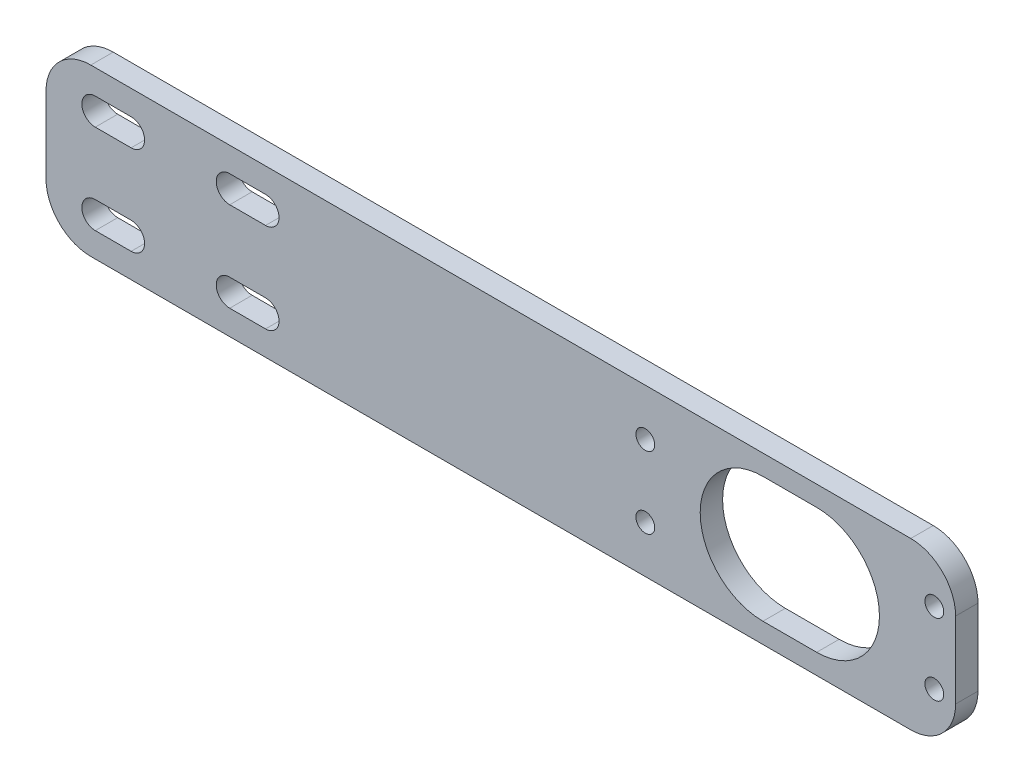
ISO-10303-21;
HEADER;
FILE_DESCRIPTION(('STEP AP214'),'2;1');
FILE_NAME('part.step','',(''),(''),'','','');
FILE_SCHEMA(('AUTOMOTIVE_DESIGN { 1 0 10303 214 1 1 1 1 }'));
ENDSEC;
DATA;
#1=APPLICATION_CONTEXT('core data for automotive mechanical design processes');
#2=APPLICATION_PROTOCOL_DEFINITION('international standard','automotive_design',2000,#1);
#3=PRODUCT_CONTEXT('',#1,'mechanical');
#4=PRODUCT('Part','Part','',(#3));
#5=PRODUCT_RELATED_PRODUCT_CATEGORY('part','',(#4));
#6=PRODUCT_DEFINITION_FORMATION('','',#4);
#7=PRODUCT_DEFINITION_CONTEXT('part definition',#1,'design');
#8=PRODUCT_DEFINITION('design','',#6,#7);
#9=PRODUCT_DEFINITION_SHAPE('','',#8);
#10=(LENGTH_UNIT() NAMED_UNIT(*) SI_UNIT(.MILLI.,.METRE.));
#11=(NAMED_UNIT(*) PLANE_ANGLE_UNIT() SI_UNIT($,.RADIAN.));
#12=(NAMED_UNIT(*) SI_UNIT($,.STERADIAN.) SOLID_ANGLE_UNIT());
#13=UNCERTAINTY_MEASURE_WITH_UNIT(LENGTH_MEASURE(1.E-05),#10,'distance_accuracy_value','');
#14=(GEOMETRIC_REPRESENTATION_CONTEXT(3) GLOBAL_UNCERTAINTY_ASSIGNED_CONTEXT((#13)) GLOBAL_UNIT_ASSIGNED_CONTEXT((#10,
#11,#12)) REPRESENTATION_CONTEXT('',''));
#15=CARTESIAN_POINT('',(0.,0.,0.));
#16=DIRECTION('',(0.,0.,1.));
#17=DIRECTION('',(1.,0.,0.));
#18=AXIS2_PLACEMENT_3D('',#15,#16,#17);
#19=CARTESIAN_POINT('',(0.,0.,-5.));
#20=DIRECTION('',(0.,0.,1.));
#21=DIRECTION('',(1.,0.,0.));
#22=AXIS2_PLACEMENT_3D('',#19,#20,#21);
#23=PLANE('',#22);
#24=CARTESIAN_POINT('',(96.7499999999993,-7.99949999999946,-5.));
#25=DIRECTION('',(0.,0.,-1.));
#26=DIRECTION('',(-1.,0.,0.));
#27=AXIS2_PLACEMENT_3D('',#24,#25,#26);
#28=CIRCLE('',#27,2.09999999999999);
#29=CARTESIAN_POINT('',(94.6499999999994,-7.99949999999946,-5.));
#30=VERTEX_POINT('',#29);
#31=EDGE_CURVE('E468',#30,#30,#28,.T.);
#32=ORIENTED_EDGE('',*,*,#31,.F.);
#33=EDGE_LOOP('',(#32));
#34=FACE_BOUND('',#33,.T.);
#35=CARTESIAN_POINT('',(96.7499999999993,8.00050000000054,-5.));
#36=DIRECTION('',(0.,0.,-1.));
#37=DIRECTION('',(-1.,0.,0.));
#38=AXIS2_PLACEMENT_3D('',#35,#36,#37);
#39=CIRCLE('',#38,2.09999999999999);
#40=CARTESIAN_POINT('',(94.6499999999993,8.00050000000054,-5.));
#41=VERTEX_POINT('',#40);
#42=EDGE_CURVE('E459',#41,#41,#39,.T.);
#43=ORIENTED_EDGE('',*,*,#42,.F.);
#44=EDGE_LOOP('',(#43));
#45=FACE_BOUND('',#44,.T.);
#46=CARTESIAN_POINT('',(32.2499999999993,8.00050000000031,-5.));
#47=DIRECTION('',(0.,0.,-1.));
#48=DIRECTION('',(-1.,0.,0.));
#49=AXIS2_PLACEMENT_3D('',#46,#47,#48);
#50=CIRCLE('',#49,2.1);
#51=CARTESIAN_POINT('',(30.1499999999993,8.00050000000031,-5.));
#52=VERTEX_POINT('',#51);
#53=EDGE_CURVE('E456',#52,#52,#50,.T.);
#54=ORIENTED_EDGE('',*,*,#53,.F.);
#55=EDGE_LOOP('',(#54));
#56=FACE_BOUND('',#55,.T.);
#57=DIRECTION('',(-1.,0.,0.));
#58=VECTOR('',#57,1.);
#59=CARTESIAN_POINT('',(-82.5,-13.,-5.));
#60=LINE('',#59,#58);
#61=CARTESIAN_POINT('',(-82.5,-13.,-5.));
#62=VERTEX_POINT('',#61);
#63=CARTESIAN_POINT('',(-90.5,-13.,-5.));
#64=VERTEX_POINT('',#63);
#65=EDGE_CURVE('E317',#62,#64,#60,.T.);
#66=ORIENTED_EDGE('',*,*,#65,.F.);
#67=CARTESIAN_POINT('',(-82.5,-10.,-5.));
#68=DIRECTION('',(0.,0.,-1.));
#69=DIRECTION('',(-1.,0.,0.));
#70=AXIS2_PLACEMENT_3D('',#67,#68,#69);
#71=CIRCLE('',#70,3.);
#72=CARTESIAN_POINT('',(-82.5,-7.,-5.));
#73=VERTEX_POINT('',#72);
#74=EDGE_CURVE('E55',#73,#62,#71,.T.);
#75=ORIENTED_EDGE('',*,*,#74,.F.);
#76=DIRECTION('',(1.,0.,0.));
#77=VECTOR('',#76,1.);
#78=CARTESIAN_POINT('',(-82.5,-7.,-5.));
#79=LINE('',#78,#77);
#80=CARTESIAN_POINT('',(-90.5,-7.,-5.));
#81=VERTEX_POINT('',#80);
#82=EDGE_CURVE('E306',#81,#73,#79,.T.);
#83=ORIENTED_EDGE('',*,*,#82,.F.);
#84=CARTESIAN_POINT('',(-90.5,-10.,-5.));
#85=DIRECTION('',(0.,0.,-1.));
#86=DIRECTION('',(-1.,0.,0.));
#87=AXIS2_PLACEMENT_3D('',#84,#85,#86);
#88=CIRCLE('',#87,3.);
#89=EDGE_CURVE('E321',#64,#81,#88,.T.);
#90=ORIENTED_EDGE('',*,*,#89,.F.);
#91=EDGE_LOOP('',(#66,#75,#83,#90));
#92=FACE_BOUND('',#91,.T.);
#93=DIRECTION('',(-1.,0.,0.));
#94=VECTOR('',#93,1.);
#95=CARTESIAN_POINT('',(-82.5,7.,-5.));
#96=LINE('',#95,#94);
#97=CARTESIAN_POINT('',(-82.5,7.,-5.));
#98=VERTEX_POINT('',#97);
#99=CARTESIAN_POINT('',(-90.5,7.,-5.));
#100=VERTEX_POINT('',#99);
#101=EDGE_CURVE('E287',#98,#100,#96,.T.);
#102=ORIENTED_EDGE('',*,*,#101,.F.);
#103=CARTESIAN_POINT('',(-82.5,10.,-5.));
#104=DIRECTION('',(0.,0.,-1.));
#105=DIRECTION('',(-1.,0.,0.));
#106=AXIS2_PLACEMENT_3D('',#103,#104,#105);
#107=CIRCLE('',#106,3.);
#108=CARTESIAN_POINT('',(-82.5,13.,-5.));
#109=VERTEX_POINT('',#108);
#110=EDGE_CURVE('E63',#109,#98,#107,.T.);
#111=ORIENTED_EDGE('',*,*,#110,.F.);
#112=DIRECTION('',(1.,0.,0.));
#113=VECTOR('',#112,1.);
#114=CARTESIAN_POINT('',(-82.5,13.,-5.));
#115=LINE('',#114,#113);
#116=CARTESIAN_POINT('',(-90.5,13.,-5.));
#117=VERTEX_POINT('',#116);
#118=EDGE_CURVE('E276',#117,#109,#115,.T.);
#119=ORIENTED_EDGE('',*,*,#118,.F.);
#120=CARTESIAN_POINT('',(-90.5,10.,-5.));
#121=DIRECTION('',(0.,0.,-1.));
#122=DIRECTION('',(-1.,0.,0.));
#123=AXIS2_PLACEMENT_3D('',#120,#121,#122);
#124=CIRCLE('',#123,3.);
#125=EDGE_CURVE('E291',#100,#117,#124,.T.);
#126=ORIENTED_EDGE('',*,*,#125,.F.);
#127=EDGE_LOOP('',(#102,#111,#119,#126));
#128=FACE_BOUND('',#127,.T.);
#129=DIRECTION('',(1.,0.,0.));
#130=VECTOR('',#129,1.);
#131=CARTESIAN_POINT('',(-60.5,13.,-5.));
#132=LINE('',#131,#130);
#133=CARTESIAN_POINT('',(-60.5,13.,-5.));
#134=VERTEX_POINT('',#133);
#135=CARTESIAN_POINT('',(-52.5,13.,-5.));
#136=VERTEX_POINT('',#135);
#137=EDGE_CURVE('E261',#134,#136,#132,.T.);
#138=ORIENTED_EDGE('',*,*,#137,.F.);
#139=CARTESIAN_POINT('',(-60.5,10.,-5.));
#140=DIRECTION('',(0.,0.,-1.));
#141=DIRECTION('',(-1.,0.,0.));
#142=AXIS2_PLACEMENT_3D('',#139,#140,#141);
#143=CIRCLE('',#142,3.);
#144=CARTESIAN_POINT('',(-60.5,7.,-5.));
#145=VERTEX_POINT('',#144);
#146=EDGE_CURVE('E231',#145,#134,#143,.T.);
#147=ORIENTED_EDGE('',*,*,#146,.F.);
#148=DIRECTION('',(-1.,0.,0.));
#149=VECTOR('',#148,1.);
#150=CARTESIAN_POINT('',(-60.5,7.,-5.));
#151=LINE('',#150,#149);
#152=CARTESIAN_POINT('',(-52.5,7.,-5.));
#153=VERTEX_POINT('',#152);
#154=EDGE_CURVE('E249',#153,#145,#151,.T.);
#155=ORIENTED_EDGE('',*,*,#154,.F.);
#156=CARTESIAN_POINT('',(-52.5,10.,-5.));
#157=DIRECTION('',(0.,0.,-1.));
#158=DIRECTION('',(-1.,0.,0.));
#159=AXIS2_PLACEMENT_3D('',#156,#157,#158);
#160=CIRCLE('',#159,3.);
#161=EDGE_CURVE('E252',#136,#153,#160,.T.);
#162=ORIENTED_EDGE('',*,*,#161,.F.);
#163=EDGE_LOOP('',(#138,#147,#155,#162));
#164=FACE_BOUND('',#163,.T.);
#165=DIRECTION('',(1.,0.,0.));
#166=VECTOR('',#165,1.);
#167=CARTESIAN_POINT('',(-60.5,-7.,-5.));
#168=LINE('',#167,#166);
#169=CARTESIAN_POINT('',(-60.5,-7.,-5.));
#170=VERTEX_POINT('',#169);
#171=CARTESIAN_POINT('',(-52.5,-7.,-5.));
#172=VERTEX_POINT('',#171);
#173=EDGE_CURVE('E347',#170,#172,#168,.T.);
#174=ORIENTED_EDGE('',*,*,#173,.F.);
#175=CARTESIAN_POINT('',(-60.5,-10.,-5.));
#176=DIRECTION('',(0.,0.,-1.));
#177=DIRECTION('',(-1.,0.,0.));
#178=AXIS2_PLACEMENT_3D('',#175,#176,#177);
#179=CIRCLE('',#178,3.);
#180=CARTESIAN_POINT('',(-60.5,-13.,-5.));
#181=VERTEX_POINT('',#180);
#182=EDGE_CURVE('E268',#181,#170,#179,.T.);
#183=ORIENTED_EDGE('',*,*,#182,.F.);
#184=DIRECTION('',(-1.,0.,0.));
#185=VECTOR('',#184,1.);
#186=CARTESIAN_POINT('',(-60.5,-13.,-5.));
#187=LINE('',#186,#185);
#188=CARTESIAN_POINT('',(-52.5,-13.,-5.));
#189=VERTEX_POINT('',#188);
#190=EDGE_CURVE('E336',#189,#181,#187,.T.);
#191=ORIENTED_EDGE('',*,*,#190,.F.);
#192=CARTESIAN_POINT('',(-52.5,-10.,-5.));
#193=DIRECTION('',(0.,0.,-1.));
#194=DIRECTION('',(-1.,0.,0.));
#195=AXIS2_PLACEMENT_3D('',#192,#193,#194);
#196=CIRCLE('',#195,3.);
#197=EDGE_CURVE('E350',#172,#189,#196,.T.);
#198=ORIENTED_EDGE('',*,*,#197,.F.);
#199=EDGE_LOOP('',(#174,#183,#191,#198));
#200=FACE_BOUND('',#199,.T.);
#201=DIRECTION('',(1.,0.,0.));
#202=VECTOR('',#201,1.);
#203=CARTESIAN_POINT('',(58.4999999999993,14.,-5.));
#204=LINE('',#203,#202);
#205=CARTESIAN_POINT('',(58.4999999999993,14.,-5.));
#206=VERTEX_POINT('',#205);
#207=CARTESIAN_POINT('',(70.4999999999993,14.,-5.));
#208=VERTEX_POINT('',#207);
#209=EDGE_CURVE('E379',#206,#208,#204,.T.);
#210=ORIENTED_EDGE('',*,*,#209,.F.);
#211=CARTESIAN_POINT('',(58.4999999999992,0.,-5.));
#212=DIRECTION('',(0.,0.,-1.));
#213=DIRECTION('',(-1.,0.,0.));
#214=AXIS2_PLACEMENT_3D('',#211,#212,#213);
#215=CIRCLE('',#214,14.);
#216=CARTESIAN_POINT('',(58.4999999999992,-14.,-5.));
#217=VERTEX_POINT('',#216);
#218=EDGE_CURVE('E357',#217,#206,#215,.T.);
#219=ORIENTED_EDGE('',*,*,#218,.F.);
#220=DIRECTION('',(-1.,0.,0.));
#221=VECTOR('',#220,1.);
#222=CARTESIAN_POINT('',(58.4999999999992,-14.,-5.));
#223=LINE('',#222,#221);
#224=CARTESIAN_POINT('',(70.4999999999993,-14.,-5.));
#225=VERTEX_POINT('',#224);
#226=EDGE_CURVE('E368',#225,#217,#223,.T.);
#227=ORIENTED_EDGE('',*,*,#226,.F.);
#228=CARTESIAN_POINT('',(70.4999999999993,0.,-5.));
#229=DIRECTION('',(0.,0.,-1.));
#230=DIRECTION('',(-1.,0.,0.));
#231=AXIS2_PLACEMENT_3D('',#228,#229,#230);
#232=CIRCLE('',#231,14.);
#233=EDGE_CURVE('E382',#208,#225,#232,.T.);
#234=ORIENTED_EDGE('',*,*,#233,.F.);
#235=EDGE_LOOP('',(#210,#219,#227,#234));
#236=FACE_BOUND('',#235,.T.);
#237=DIRECTION('',(1.,0.,0.));
#238=VECTOR('',#237,1.);
#239=CARTESIAN_POINT('',(-101.5,-18.5,-5.));
#240=LINE('',#239,#238);
#241=CARTESIAN_POINT('',(-91.5,-18.5,-5.));
#242=VERTEX_POINT('',#241);
#243=CARTESIAN_POINT('',(91.5,-18.5,-5.));
#244=VERTEX_POINT('',#243);
#245=EDGE_CURVE('E406',#242,#244,#240,.T.);
#246=ORIENTED_EDGE('',*,*,#245,.F.);
#247=CARTESIAN_POINT('',(-91.5,-8.5,-5.));
#248=DIRECTION('',(0.,0.,1.));
#249=DIRECTION('',(1.,0.,0.));
#250=AXIS2_PLACEMENT_3D('',#247,#248,#249);
#251=CIRCLE('',#250,10.);
#252=CARTESIAN_POINT('',(-101.5,-8.5,-5.));
#253=VERTEX_POINT('',#252);
#254=EDGE_CURVE('E443',#242,#253,#251,.F.);
#255=ORIENTED_EDGE('',*,*,#254,.T.);
#256=DIRECTION('',(0.,-1.,0.));
#257=VECTOR('',#256,1.);
#258=CARTESIAN_POINT('',(-101.5,18.5,-5.));
#259=LINE('',#258,#257);
#260=CARTESIAN_POINT('',(-101.5,8.49999999999999,-5.));
#261=VERTEX_POINT('',#260);
#262=EDGE_CURVE('E403',#261,#253,#259,.T.);
#263=ORIENTED_EDGE('',*,*,#262,.F.);
#264=CARTESIAN_POINT('',(-91.5,8.49999999999999,-5.));
#265=DIRECTION('',(0.,0.,1.));
#266=DIRECTION('',(1.,0.,0.));
#267=AXIS2_PLACEMENT_3D('',#264,#265,#266);
#268=CIRCLE('',#267,10.);
#269=CARTESIAN_POINT('',(-91.5,18.5,-5.));
#270=VERTEX_POINT('',#269);
#271=EDGE_CURVE('E441',#261,#270,#268,.F.);
#272=ORIENTED_EDGE('',*,*,#271,.T.);
#273=DIRECTION('',(-1.,0.,0.));
#274=VECTOR('',#273,1.);
#275=CARTESIAN_POINT('',(-101.5,18.5,-5.));
#276=LINE('',#275,#274);
#277=CARTESIAN_POINT('',(91.5,18.5,-5.));
#278=VERTEX_POINT('',#277);
#279=EDGE_CURVE('E399',#278,#270,#276,.T.);
#280=ORIENTED_EDGE('',*,*,#279,.F.);
#281=CARTESIAN_POINT('',(91.5,8.49999999999999,-5.));
#282=DIRECTION('',(0.,0.,1.));
#283=DIRECTION('',(1.,0.,0.));
#284=AXIS2_PLACEMENT_3D('',#281,#282,#283);
#285=CIRCLE('',#284,10.);
#286=CARTESIAN_POINT('',(101.5,8.49999999999999,-5.));
#287=VERTEX_POINT('',#286);
#288=EDGE_CURVE('E437',#278,#287,#285,.F.);
#289=ORIENTED_EDGE('',*,*,#288,.T.);
#290=DIRECTION('',(0.,1.,0.));
#291=VECTOR('',#290,1.);
#292=CARTESIAN_POINT('',(101.5,18.5,-5.));
#293=LINE('',#292,#291);
#294=CARTESIAN_POINT('',(101.5,-8.5,-5.));
#295=VERTEX_POINT('',#294);
#296=EDGE_CURVE('E396',#295,#287,#293,.T.);
#297=ORIENTED_EDGE('',*,*,#296,.F.);
#298=CARTESIAN_POINT('',(91.5,-8.5,-5.));
#299=DIRECTION('',(0.,0.,1.));
#300=DIRECTION('',(1.,0.,0.));
#301=AXIS2_PLACEMENT_3D('',#298,#299,#300);
#302=CIRCLE('',#301,10.);
#303=EDGE_CURVE('E439',#295,#244,#302,.F.);
#304=ORIENTED_EDGE('',*,*,#303,.T.);
#305=EDGE_LOOP('',(#246,#255,#263,#272,#280,#289,#297,#304));
#306=FACE_BOUND('',#305,.T.);
#307=CARTESIAN_POINT('',(32.2499999999993,-7.99949999999969,-5.));
#308=DIRECTION('',(0.,0.,-1.));
#309=DIRECTION('',(-1.,0.,0.));
#310=AXIS2_PLACEMENT_3D('',#307,#308,#309);
#311=CIRCLE('',#310,2.1);
#312=CARTESIAN_POINT('',(30.1499999999993,-7.99949999999969,-5.));
#313=VERTEX_POINT('',#312);
#314=EDGE_CURVE('E255',#313,#313,#311,.T.);
#315=ORIENTED_EDGE('',*,*,#314,.F.);
#316=EDGE_LOOP('',(#315));
#317=FACE_BOUND('',#316,.T.);
#318=ADVANCED_FACE('F38',(#34,#45,#56,#92,#128,#164,#200,#236,#306,#317),#23,.F.);
#319=CARTESIAN_POINT('',(101.5,18.5,-5.));
#320=DIRECTION('',(1.,0.,0.));
#321=DIRECTION('',(0.,0.,-1.));
#322=AXIS2_PLACEMENT_3D('',#319,#320,#321);
#323=PLANE('',#322);
#324=DIRECTION('',(0.,1.,0.));
#325=VECTOR('',#324,1.);
#326=CARTESIAN_POINT('',(101.5,18.5,0.));
#327=LINE('',#326,#325);
#328=CARTESIAN_POINT('',(101.5,-8.5,0.));
#329=VERTEX_POINT('',#328);
#330=CARTESIAN_POINT('',(101.5,8.49999999999999,0.));
#331=VERTEX_POINT('',#330);
#332=EDGE_CURVE('E389',#329,#331,#327,.T.);
#333=ORIENTED_EDGE('',*,*,#332,.F.);
#334=DIRECTION('',(0.,0.,1.));
#335=VECTOR('',#334,1.);
#336=CARTESIAN_POINT('',(101.5,-8.5,-5.));
#337=LINE('',#336,#335);
#338=EDGE_CURVE('E11',#329,#295,#337,.F.);
#339=ORIENTED_EDGE('',*,*,#338,.T.);
#340=ORIENTED_EDGE('',*,*,#296,.T.);
#341=DIRECTION('',(0.,0.,1.));
#342=VECTOR('',#341,1.);
#343=CARTESIAN_POINT('',(101.5,8.49999999999999,-5.));
#344=LINE('',#343,#342);
#345=EDGE_CURVE('E47',#287,#331,#344,.T.);
#346=ORIENTED_EDGE('',*,*,#345,.T.);
#347=EDGE_LOOP('',(#333,#339,#340,#346));
#348=FACE_BOUND('',#347,.T.);
#349=ADVANCED_FACE('F477',(#348),#323,.T.);
#350=CARTESIAN_POINT('',(-101.5,-18.5,-5.));
#351=DIRECTION('',(0.,-1.,0.));
#352=DIRECTION('',(0.,0.,-1.));
#353=AXIS2_PLACEMENT_3D('',#350,#351,#352);
#354=PLANE('',#353);
#355=DIRECTION('',(1.,0.,0.));
#356=VECTOR('',#355,1.);
#357=CARTESIAN_POINT('',(-101.5,-18.5,0.));
#358=LINE('',#357,#356);
#359=CARTESIAN_POINT('',(-91.5,-18.5,0.));
#360=VERTEX_POINT('',#359);
#361=CARTESIAN_POINT('',(91.5,-18.5,0.));
#362=VERTEX_POINT('',#361);
#363=EDGE_CURVE('E400',#360,#362,#358,.T.);
#364=ORIENTED_EDGE('',*,*,#363,.F.);
#365=DIRECTION('',(0.,0.,1.));
#366=VECTOR('',#365,1.);
#367=CARTESIAN_POINT('',(-91.5,-18.5,-5.));
#368=LINE('',#367,#366);
#369=EDGE_CURVE('E435',#360,#242,#368,.F.);
#370=ORIENTED_EDGE('',*,*,#369,.T.);
#371=ORIENTED_EDGE('',*,*,#245,.T.);
#372=DIRECTION('',(0.,0.,1.));
#373=VECTOR('',#372,1.);
#374=CARTESIAN_POINT('',(91.5,-18.5,-5.));
#375=LINE('',#374,#373);
#376=EDGE_CURVE('E432',#244,#362,#375,.T.);
#377=ORIENTED_EDGE('',*,*,#376,.T.);
#378=EDGE_LOOP('',(#364,#370,#371,#377));
#379=FACE_BOUND('',#378,.T.);
#380=ADVANCED_FACE('F597',(#379),#354,.T.);
#381=CARTESIAN_POINT('',(-101.5,18.5,-5.));
#382=DIRECTION('',(-1.,0.,0.));
#383=DIRECTION('',(0.,0.,1.));
#384=AXIS2_PLACEMENT_3D('',#381,#382,#383);
#385=PLANE('',#384);
#386=ORIENTED_EDGE('',*,*,#262,.T.);
#387=DIRECTION('',(0.,0.,1.));
#388=VECTOR('',#387,1.);
#389=CARTESIAN_POINT('',(-101.5,-8.5,-5.));
#390=LINE('',#389,#388);
#391=CARTESIAN_POINT('',(-101.5,-8.5,0.));
#392=VERTEX_POINT('',#391);
#393=EDGE_CURVE('E421',#253,#392,#390,.T.);
#394=ORIENTED_EDGE('',*,*,#393,.T.);
#395=DIRECTION('',(0.,-1.,0.));
#396=VECTOR('',#395,1.);
#397=CARTESIAN_POINT('',(-101.5,18.5,0.));
#398=LINE('',#397,#396);
#399=CARTESIAN_POINT('',(-101.5,8.49999999999999,0.));
#400=VERTEX_POINT('',#399);
#401=EDGE_CURVE('E415',#400,#392,#398,.T.);
#402=ORIENTED_EDGE('',*,*,#401,.F.);
#403=DIRECTION('',(0.,0.,1.));
#404=VECTOR('',#403,1.);
#405=CARTESIAN_POINT('',(-101.5,8.49999999999999,-5.));
#406=LINE('',#405,#404);
#407=EDGE_CURVE('E409',#400,#261,#406,.F.);
#408=ORIENTED_EDGE('',*,*,#407,.T.);
#409=EDGE_LOOP('',(#386,#394,#402,#408));
#410=FACE_BOUND('',#409,.T.);
#411=ADVANCED_FACE('F600',(#410),#385,.T.);
#412=CARTESIAN_POINT('',(-101.5,18.5,-5.));
#413=DIRECTION('',(0.,1.,0.));
#414=DIRECTION('',(0.,0.,1.));
#415=AXIS2_PLACEMENT_3D('',#412,#413,#414);
#416=PLANE('',#415);
#417=ORIENTED_EDGE('',*,*,#279,.T.);
#418=DIRECTION('',(0.,0.,1.));
#419=VECTOR('',#418,1.);
#420=CARTESIAN_POINT('',(-91.5,18.5,-5.));
#421=LINE('',#420,#419);
#422=CARTESIAN_POINT('',(-91.5,18.5,0.));
#423=VERTEX_POINT('',#422);
#424=EDGE_CURVE('E447',#270,#423,#421,.T.);
#425=ORIENTED_EDGE('',*,*,#424,.T.);
#426=DIRECTION('',(-1.,0.,0.));
#427=VECTOR('',#426,1.);
#428=CARTESIAN_POINT('',(-101.5,18.5,0.));
#429=LINE('',#428,#427);
#430=CARTESIAN_POINT('',(91.5,18.5,0.));
#431=VERTEX_POINT('',#430);
#432=EDGE_CURVE('E412',#431,#423,#429,.T.);
#433=ORIENTED_EDGE('',*,*,#432,.F.);
#434=DIRECTION('',(0.,0.,1.));
#435=VECTOR('',#434,1.);
#436=CARTESIAN_POINT('',(91.5,18.5,-5.));
#437=LINE('',#436,#435);
#438=EDGE_CURVE('E445',#431,#278,#437,.F.);
#439=ORIENTED_EDGE('',*,*,#438,.T.);
#440=EDGE_LOOP('',(#417,#425,#433,#439));
#441=FACE_BOUND('',#440,.T.);
#442=ADVANCED_FACE('F595',(#441),#416,.T.);
#443=CARTESIAN_POINT('',(0.,0.,0.));
#444=DIRECTION('',(0.,0.,1.));
#445=DIRECTION('',(1.,0.,0.));
#446=AXIS2_PLACEMENT_3D('',#443,#444,#445);
#447=PLANE('',#446);
#448=CARTESIAN_POINT('',(96.7499999999993,-7.99949999999946,0.));
#449=DIRECTION('',(0.,0.,1.));
#450=DIRECTION('',(1.,0.,0.));
#451=AXIS2_PLACEMENT_3D('',#448,#449,#450);
#452=CIRCLE('',#451,2.09999999999999);
#453=CARTESIAN_POINT('',(98.8499999999993,-7.99949999999946,0.));
#454=VERTEX_POINT('',#453);
#455=EDGE_CURVE('E42',#454,#454,#452,.T.);
#456=ORIENTED_EDGE('',*,*,#455,.F.);
#457=EDGE_LOOP('',(#456));
#458=FACE_BOUND('',#457,.T.);
#459=CARTESIAN_POINT('',(96.7499999999993,8.00050000000054,0.));
#460=DIRECTION('',(0.,0.,1.));
#461=DIRECTION('',(1.,0.,0.));
#462=AXIS2_PLACEMENT_3D('',#459,#460,#461);
#463=CIRCLE('',#462,2.09999999999999);
#464=CARTESIAN_POINT('',(98.8499999999993,8.00050000000054,0.));
#465=VERTEX_POINT('',#464);
#466=EDGE_CURVE('E457',#465,#465,#463,.T.);
#467=ORIENTED_EDGE('',*,*,#466,.F.);
#468=EDGE_LOOP('',(#467));
#469=FACE_BOUND('',#468,.T.);
#470=CARTESIAN_POINT('',(32.2499999999993,8.00050000000031,0.));
#471=DIRECTION('',(0.,0.,1.));
#472=DIRECTION('',(1.,0.,0.));
#473=AXIS2_PLACEMENT_3D('',#470,#471,#472);
#474=CIRCLE('',#473,2.1);
#475=CARTESIAN_POINT('',(34.3499999999993,8.00050000000031,0.));
#476=VERTEX_POINT('',#475);
#477=EDGE_CURVE('E454',#476,#476,#474,.T.);
#478=ORIENTED_EDGE('',*,*,#477,.F.);
#479=EDGE_LOOP('',(#478));
#480=FACE_BOUND('',#479,.T.);
#481=CARTESIAN_POINT('',(32.2499999999993,-7.99949999999969,0.));
#482=DIRECTION('',(0.,0.,1.));
#483=DIRECTION('',(1.,0.,0.));
#484=AXIS2_PLACEMENT_3D('',#481,#482,#483);
#485=CIRCLE('',#484,2.1);
#486=CARTESIAN_POINT('',(34.3499999999993,-7.99949999999969,0.));
#487=VERTEX_POINT('',#486);
#488=EDGE_CURVE('E318',#487,#487,#485,.T.);
#489=ORIENTED_EDGE('',*,*,#488,.F.);
#490=EDGE_LOOP('',(#489));
#491=FACE_BOUND('',#490,.T.);
#492=CARTESIAN_POINT('',(-82.5,-10.,0.));
#493=DIRECTION('',(0.,0.,-1.));
#494=DIRECTION('',(-1.,0.,0.));
#495=AXIS2_PLACEMENT_3D('',#492,#493,#494);
#496=CIRCLE('',#495,3.);
#497=CARTESIAN_POINT('',(-82.5,-7.,0.));
#498=VERTEX_POINT('',#497);
#499=CARTESIAN_POINT('',(-82.5,-13.,0.));
#500=VERTEX_POINT('',#499);
#501=EDGE_CURVE('E302',#498,#500,#496,.T.);
#502=ORIENTED_EDGE('',*,*,#501,.T.);
#503=DIRECTION('',(-1.,0.,0.));
#504=VECTOR('',#503,1.);
#505=CARTESIAN_POINT('',(-82.5,-13.,0.));
#506=LINE('',#505,#504);
#507=CARTESIAN_POINT('',(-90.5,-13.,0.));
#508=VERTEX_POINT('',#507);
#509=EDGE_CURVE('E305',#500,#508,#506,.T.);
#510=ORIENTED_EDGE('',*,*,#509,.T.);
#511=CARTESIAN_POINT('',(-90.5,-10.,0.));
#512=DIRECTION('',(0.,0.,-1.));
#513=DIRECTION('',(-1.,0.,0.));
#514=AXIS2_PLACEMENT_3D('',#511,#512,#513);
#515=CIRCLE('',#514,3.);
#516=CARTESIAN_POINT('',(-90.5,-7.,0.));
#517=VERTEX_POINT('',#516);
#518=EDGE_CURVE('E309',#508,#517,#515,.T.);
#519=ORIENTED_EDGE('',*,*,#518,.T.);
#520=DIRECTION('',(1.,0.,0.));
#521=VECTOR('',#520,1.);
#522=CARTESIAN_POINT('',(-82.5,-7.,0.));
#523=LINE('',#522,#521);
#524=EDGE_CURVE('E312',#517,#498,#523,.T.);
#525=ORIENTED_EDGE('',*,*,#524,.T.);
#526=EDGE_LOOP('',(#502,#510,#519,#525));
#527=FACE_BOUND('',#526,.T.);
#528=CARTESIAN_POINT('',(-82.5,10.,0.));
#529=DIRECTION('',(0.,0.,-1.));
#530=DIRECTION('',(-1.,0.,0.));
#531=AXIS2_PLACEMENT_3D('',#528,#529,#530);
#532=CIRCLE('',#531,3.);
#533=CARTESIAN_POINT('',(-82.5,13.,0.));
#534=VERTEX_POINT('',#533);
#535=CARTESIAN_POINT('',(-82.5,7.,0.));
#536=VERTEX_POINT('',#535);
#537=EDGE_CURVE('E272',#534,#536,#532,.T.);
#538=ORIENTED_EDGE('',*,*,#537,.T.);
#539=DIRECTION('',(-1.,0.,0.));
#540=VECTOR('',#539,1.);
#541=CARTESIAN_POINT('',(-82.5,7.,0.));
#542=LINE('',#541,#540);
#543=CARTESIAN_POINT('',(-90.5,7.,0.));
#544=VERTEX_POINT('',#543);
#545=EDGE_CURVE('E275',#536,#544,#542,.T.);
#546=ORIENTED_EDGE('',*,*,#545,.T.);
#547=CARTESIAN_POINT('',(-90.5,10.,0.));
#548=DIRECTION('',(0.,0.,-1.));
#549=DIRECTION('',(-1.,0.,0.));
#550=AXIS2_PLACEMENT_3D('',#547,#548,#549);
#551=CIRCLE('',#550,3.);
#552=CARTESIAN_POINT('',(-90.5,13.,0.));
#553=VERTEX_POINT('',#552);
#554=EDGE_CURVE('E279',#544,#553,#551,.T.);
#555=ORIENTED_EDGE('',*,*,#554,.T.);
#556=DIRECTION('',(1.,0.,0.));
#557=VECTOR('',#556,1.);
#558=CARTESIAN_POINT('',(-82.5,13.,0.));
#559=LINE('',#558,#557);
#560=EDGE_CURVE('E282',#553,#534,#559,.T.);
#561=ORIENTED_EDGE('',*,*,#560,.T.);
#562=EDGE_LOOP('',(#538,#546,#555,#561));
#563=FACE_BOUND('',#562,.T.);
#564=CARTESIAN_POINT('',(-60.5,10.,0.));
#565=DIRECTION('',(0.,0.,-1.));
#566=DIRECTION('',(-1.,0.,0.));
#567=AXIS2_PLACEMENT_3D('',#564,#565,#566);
#568=CIRCLE('',#567,3.);
#569=CARTESIAN_POINT('',(-60.5,7.,0.));
#570=VERTEX_POINT('',#569);
#571=CARTESIAN_POINT('',(-60.5,13.,0.));
#572=VERTEX_POINT('',#571);
#573=EDGE_CURVE('E228',#570,#572,#568,.T.);
#574=ORIENTED_EDGE('',*,*,#573,.T.);
#575=DIRECTION('',(1.,0.,0.));
#576=VECTOR('',#575,1.);
#577=CARTESIAN_POINT('',(-60.5,13.,0.));
#578=LINE('',#577,#576);
#579=CARTESIAN_POINT('',(-52.5,13.,0.));
#580=VERTEX_POINT('',#579);
#581=EDGE_CURVE('E240',#572,#580,#578,.T.);
#582=ORIENTED_EDGE('',*,*,#581,.T.);
#583=CARTESIAN_POINT('',(-52.5,10.,0.));
#584=DIRECTION('',(0.,0.,-1.));
#585=DIRECTION('',(-1.,0.,0.));
#586=AXIS2_PLACEMENT_3D('',#583,#584,#585);
#587=CIRCLE('',#586,3.);
#588=CARTESIAN_POINT('',(-52.5,7.,0.));
#589=VERTEX_POINT('',#588);
#590=EDGE_CURVE('E244',#580,#589,#587,.T.);
#591=ORIENTED_EDGE('',*,*,#590,.T.);
#592=DIRECTION('',(-1.,0.,0.));
#593=VECTOR('',#592,1.);
#594=CARTESIAN_POINT('',(-60.5,7.,0.));
#595=LINE('',#594,#593);
#596=EDGE_CURVE('E236',#589,#570,#595,.T.);
#597=ORIENTED_EDGE('',*,*,#596,.T.);
#598=EDGE_LOOP('',(#574,#582,#591,#597));
#599=FACE_BOUND('',#598,.T.);
#600=CARTESIAN_POINT('',(-60.5,-10.,0.));
#601=DIRECTION('',(0.,0.,-1.));
#602=DIRECTION('',(-1.,0.,0.));
#603=AXIS2_PLACEMENT_3D('',#600,#601,#602);
#604=CIRCLE('',#603,3.);
#605=CARTESIAN_POINT('',(-60.5,-13.,0.));
#606=VERTEX_POINT('',#605);
#607=CARTESIAN_POINT('',(-60.5,-7.,0.));
#608=VERTEX_POINT('',#607);
#609=EDGE_CURVE('E332',#606,#608,#604,.T.);
#610=ORIENTED_EDGE('',*,*,#609,.T.);
#611=DIRECTION('',(1.,0.,0.));
#612=VECTOR('',#611,1.);
#613=CARTESIAN_POINT('',(-60.5,-7.,0.));
#614=LINE('',#613,#612);
#615=CARTESIAN_POINT('',(-52.5,-7.,0.));
#616=VERTEX_POINT('',#615);
#617=EDGE_CURVE('E335',#608,#616,#614,.T.);
#618=ORIENTED_EDGE('',*,*,#617,.T.);
#619=CARTESIAN_POINT('',(-52.5,-10.,0.));
#620=DIRECTION('',(0.,0.,-1.));
#621=DIRECTION('',(-1.,0.,0.));
#622=AXIS2_PLACEMENT_3D('',#619,#620,#621);
#623=CIRCLE('',#622,3.);
#624=CARTESIAN_POINT('',(-52.5,-13.,0.));
#625=VERTEX_POINT('',#624);
#626=EDGE_CURVE('E339',#616,#625,#623,.T.);
#627=ORIENTED_EDGE('',*,*,#626,.T.);
#628=DIRECTION('',(-1.,0.,0.));
#629=VECTOR('',#628,1.);
#630=CARTESIAN_POINT('',(-60.5,-13.,0.));
#631=LINE('',#630,#629);
#632=EDGE_CURVE('E342',#625,#606,#631,.T.);
#633=ORIENTED_EDGE('',*,*,#632,.T.);
#634=EDGE_LOOP('',(#610,#618,#627,#633));
#635=FACE_BOUND('',#634,.T.);
#636=CARTESIAN_POINT('',(58.4999999999992,0.,0.));
#637=DIRECTION('',(0.,0.,-1.));
#638=DIRECTION('',(-1.,0.,0.));
#639=AXIS2_PLACEMENT_3D('',#636,#637,#638);
#640=CIRCLE('',#639,14.);
#641=CARTESIAN_POINT('',(58.4999999999992,-14.,0.));
#642=VERTEX_POINT('',#641);
#643=CARTESIAN_POINT('',(58.4999999999993,14.,0.));
#644=VERTEX_POINT('',#643);
#645=EDGE_CURVE('E364',#642,#644,#640,.T.);
#646=ORIENTED_EDGE('',*,*,#645,.T.);
#647=DIRECTION('',(1.,0.,0.));
#648=VECTOR('',#647,1.);
#649=CARTESIAN_POINT('',(58.4999999999993,14.,0.));
#650=LINE('',#649,#648);
#651=CARTESIAN_POINT('',(70.4999999999993,14.,0.));
#652=VERTEX_POINT('',#651);
#653=EDGE_CURVE('E367',#644,#652,#650,.T.);
#654=ORIENTED_EDGE('',*,*,#653,.T.);
#655=CARTESIAN_POINT('',(70.4999999999993,0.,0.));
#656=DIRECTION('',(0.,0.,-1.));
#657=DIRECTION('',(-1.,0.,0.));
#658=AXIS2_PLACEMENT_3D('',#655,#656,#657);
#659=CIRCLE('',#658,14.);
#660=CARTESIAN_POINT('',(70.4999999999993,-14.,0.));
#661=VERTEX_POINT('',#660);
#662=EDGE_CURVE('E371',#652,#661,#659,.T.);
#663=ORIENTED_EDGE('',*,*,#662,.T.);
#664=DIRECTION('',(-1.,0.,0.));
#665=VECTOR('',#664,1.);
#666=CARTESIAN_POINT('',(58.4999999999992,-14.,0.));
#667=LINE('',#666,#665);
#668=EDGE_CURVE('E374',#661,#642,#667,.T.);
#669=ORIENTED_EDGE('',*,*,#668,.T.);
#670=EDGE_LOOP('',(#646,#654,#663,#669));
#671=FACE_BOUND('',#670,.T.);
#672=ORIENTED_EDGE('',*,*,#401,.T.);
#673=CARTESIAN_POINT('',(-91.5,-8.5,0.));
#674=DIRECTION('',(0.,0.,1.));
#675=DIRECTION('',(1.,0.,0.));
#676=AXIS2_PLACEMENT_3D('',#673,#674,#675);
#677=CIRCLE('',#676,10.);
#678=EDGE_CURVE('E430',#392,#360,#677,.T.);
#679=ORIENTED_EDGE('',*,*,#678,.T.);
#680=ORIENTED_EDGE('',*,*,#363,.T.);
#681=CARTESIAN_POINT('',(91.5,-8.5,0.));
#682=DIRECTION('',(0.,0.,1.));
#683=DIRECTION('',(1.,0.,0.));
#684=AXIS2_PLACEMENT_3D('',#681,#682,#683);
#685=CIRCLE('',#684,10.);
#686=EDGE_CURVE('E426',#362,#329,#685,.T.);
#687=ORIENTED_EDGE('',*,*,#686,.T.);
#688=ORIENTED_EDGE('',*,*,#332,.T.);
#689=CARTESIAN_POINT('',(91.5,8.49999999999999,0.));
#690=DIRECTION('',(0.,0.,1.));
#691=DIRECTION('',(1.,0.,0.));
#692=AXIS2_PLACEMENT_3D('',#689,#690,#691);
#693=CIRCLE('',#692,10.);
#694=EDGE_CURVE('E424',#331,#431,#693,.T.);
#695=ORIENTED_EDGE('',*,*,#694,.T.);
#696=ORIENTED_EDGE('',*,*,#432,.T.);
#697=CARTESIAN_POINT('',(-91.5,8.49999999999999,0.));
#698=DIRECTION('',(0.,0.,1.));
#699=DIRECTION('',(1.,0.,0.));
#700=AXIS2_PLACEMENT_3D('',#697,#698,#699);
#701=CIRCLE('',#700,10.);
#702=EDGE_CURVE('E428',#423,#400,#701,.T.);
#703=ORIENTED_EDGE('',*,*,#702,.T.);
#704=EDGE_LOOP('',(#672,#679,#680,#687,#688,#695,#696,#703));
#705=FACE_BOUND('',#704,.T.);
#706=ADVANCED_FACE('F246',(#458,#469,#480,#491,#527,#563,#599,#635,#671,#705),#447,.T.);
#707=CARTESIAN_POINT('',(-91.5,-8.5,-5.));
#708=DIRECTION('',(0.,0.,1.));
#709=DIRECTION('',(1.,0.,0.));
#710=AXIS2_PLACEMENT_3D('',#707,#708,#709);
#711=CYLINDRICAL_SURFACE('',#710,10.);
#712=ORIENTED_EDGE('',*,*,#254,.F.);
#713=ORIENTED_EDGE('',*,*,#369,.F.);
#714=ORIENTED_EDGE('',*,*,#678,.F.);
#715=ORIENTED_EDGE('',*,*,#393,.F.);
#716=EDGE_LOOP('',(#712,#713,#714,#715));
#717=FACE_BOUND('',#716,.T.);
#718=ADVANCED_FACE('F594',(#717),#711,.T.);
#719=CARTESIAN_POINT('',(-91.5,8.49999999999999,-5.));
#720=DIRECTION('',(0.,0.,1.));
#721=DIRECTION('',(1.,0.,0.));
#722=AXIS2_PLACEMENT_3D('',#719,#720,#721);
#723=CYLINDRICAL_SURFACE('',#722,10.);
#724=ORIENTED_EDGE('',*,*,#271,.F.);
#725=ORIENTED_EDGE('',*,*,#407,.F.);
#726=ORIENTED_EDGE('',*,*,#702,.F.);
#727=ORIENTED_EDGE('',*,*,#424,.F.);
#728=EDGE_LOOP('',(#724,#725,#726,#727));
#729=FACE_BOUND('',#728,.T.);
#730=ADVANCED_FACE('F613',(#729),#723,.T.);
#731=CARTESIAN_POINT('',(91.5,-8.5,-5.));
#732=DIRECTION('',(0.,0.,1.));
#733=DIRECTION('',(1.,0.,0.));
#734=AXIS2_PLACEMENT_3D('',#731,#732,#733);
#735=CYLINDRICAL_SURFACE('',#734,10.);
#736=ORIENTED_EDGE('',*,*,#303,.F.);
#737=ORIENTED_EDGE('',*,*,#338,.F.);
#738=ORIENTED_EDGE('',*,*,#686,.F.);
#739=ORIENTED_EDGE('',*,*,#376,.F.);
#740=EDGE_LOOP('',(#736,#737,#738,#739));
#741=FACE_BOUND('',#740,.T.);
#742=ADVANCED_FACE('F616',(#741),#735,.T.);
#743=CARTESIAN_POINT('',(91.5,8.49999999999999,-5.));
#744=DIRECTION('',(0.,0.,1.));
#745=DIRECTION('',(1.,0.,0.));
#746=AXIS2_PLACEMENT_3D('',#743,#744,#745);
#747=CYLINDRICAL_SURFACE('',#746,10.);
#748=ORIENTED_EDGE('',*,*,#288,.F.);
#749=ORIENTED_EDGE('',*,*,#438,.F.);
#750=ORIENTED_EDGE('',*,*,#694,.F.);
#751=ORIENTED_EDGE('',*,*,#345,.F.);
#752=EDGE_LOOP('',(#748,#749,#750,#751));
#753=FACE_BOUND('',#752,.T.);
#754=ADVANCED_FACE('F40',(#753),#747,.T.);
#755=CARTESIAN_POINT('',(58.4999999999992,0.,0.));
#756=DIRECTION('',(0.,0.,-1.));
#757=DIRECTION('',(-1.,0.,0.));
#758=AXIS2_PLACEMENT_3D('',#755,#756,#757);
#759=CYLINDRICAL_SURFACE('',#758,14.);
#760=ORIENTED_EDGE('',*,*,#218,.T.);
#761=DIRECTION('',(0.,0.,-1.));
#762=VECTOR('',#761,1.);
#763=CARTESIAN_POINT('',(58.4999999999993,14.,0.));
#764=LINE('',#763,#762);
#765=EDGE_CURVE('E377',#644,#206,#764,.T.);
#766=ORIENTED_EDGE('',*,*,#765,.F.);
#767=ORIENTED_EDGE('',*,*,#645,.F.);
#768=DIRECTION('',(0.,0.,-1.));
#769=VECTOR('',#768,1.);
#770=CARTESIAN_POINT('',(58.4999999999992,-14.,0.));
#771=LINE('',#770,#769);
#772=EDGE_CURVE('E387',#642,#217,#771,.T.);
#773=ORIENTED_EDGE('',*,*,#772,.T.);
#774=EDGE_LOOP('',(#760,#766,#767,#773));
#775=FACE_BOUND('',#774,.T.);
#776=ADVANCED_FACE('F581',(#775),#759,.F.);
#777=CARTESIAN_POINT('',(58.4999999999992,-14.,0.));
#778=DIRECTION('',(0.,-1.,0.));
#779=DIRECTION('',(1.,0.,0.));
#780=AXIS2_PLACEMENT_3D('',#777,#778,#779);
#781=PLANE('',#780);
#782=ORIENTED_EDGE('',*,*,#226,.T.);
#783=ORIENTED_EDGE('',*,*,#772,.F.);
#784=ORIENTED_EDGE('',*,*,#668,.F.);
#785=DIRECTION('',(0.,0.,-1.));
#786=VECTOR('',#785,1.);
#787=CARTESIAN_POINT('',(70.4999999999993,-14.,0.));
#788=LINE('',#787,#786);
#789=EDGE_CURVE('E390',#661,#225,#788,.T.);
#790=ORIENTED_EDGE('',*,*,#789,.T.);
#791=EDGE_LOOP('',(#782,#783,#784,#790));
#792=FACE_BOUND('',#791,.T.);
#793=ADVANCED_FACE('F577',(#792),#781,.F.);
#794=CARTESIAN_POINT('',(70.4999999999993,0.,0.));
#795=DIRECTION('',(0.,0.,-1.));
#796=DIRECTION('',(-1.,0.,0.));
#797=AXIS2_PLACEMENT_3D('',#794,#795,#796);
#798=CYLINDRICAL_SURFACE('',#797,14.);
#799=ORIENTED_EDGE('',*,*,#233,.T.);
#800=ORIENTED_EDGE('',*,*,#789,.F.);
#801=ORIENTED_EDGE('',*,*,#662,.F.);
#802=DIRECTION('',(0.,0.,-1.));
#803=VECTOR('',#802,1.);
#804=CARTESIAN_POINT('',(70.4999999999993,14.,0.));
#805=LINE('',#804,#803);
#806=EDGE_CURVE('E392',#652,#208,#805,.T.);
#807=ORIENTED_EDGE('',*,*,#806,.T.);
#808=EDGE_LOOP('',(#799,#800,#801,#807));
#809=FACE_BOUND('',#808,.T.);
#810=ADVANCED_FACE('F580',(#809),#798,.F.);
#811=CARTESIAN_POINT('',(58.4999999999993,14.,0.));
#812=DIRECTION('',(0.,1.,0.));
#813=DIRECTION('',(-1.,0.,0.));
#814=AXIS2_PLACEMENT_3D('',#811,#812,#813);
#815=PLANE('',#814);
#816=ORIENTED_EDGE('',*,*,#209,.T.);
#817=ORIENTED_EDGE('',*,*,#806,.F.);
#818=ORIENTED_EDGE('',*,*,#653,.F.);
#819=ORIENTED_EDGE('',*,*,#765,.T.);
#820=EDGE_LOOP('',(#816,#817,#818,#819));
#821=FACE_BOUND('',#820,.T.);
#822=ADVANCED_FACE('F575',(#821),#815,.F.);
#823=CARTESIAN_POINT('',(-60.5,-10.,0.));
#824=DIRECTION('',(0.,0.,-1.));
#825=DIRECTION('',(-1.,0.,0.));
#826=AXIS2_PLACEMENT_3D('',#823,#824,#825);
#827=CYLINDRICAL_SURFACE('',#826,3.);
#828=ORIENTED_EDGE('',*,*,#182,.T.);
#829=DIRECTION('',(0.,0.,-1.));
#830=VECTOR('',#829,1.);
#831=CARTESIAN_POINT('',(-60.5,-7.,0.));
#832=LINE('',#831,#830);
#833=EDGE_CURVE('E345',#608,#170,#832,.T.);
#834=ORIENTED_EDGE('',*,*,#833,.F.);
#835=ORIENTED_EDGE('',*,*,#609,.F.);
#836=DIRECTION('',(0.,0.,-1.));
#837=VECTOR('',#836,1.);
#838=CARTESIAN_POINT('',(-60.5,-13.,0.));
#839=LINE('',#838,#837);
#840=EDGE_CURVE('E355',#606,#181,#839,.T.);
#841=ORIENTED_EDGE('',*,*,#840,.T.);
#842=EDGE_LOOP('',(#828,#834,#835,#841));
#843=FACE_BOUND('',#842,.T.);
#844=ADVANCED_FACE('F565',(#843),#827,.F.);
#845=CARTESIAN_POINT('',(-60.5,-13.,0.));
#846=DIRECTION('',(0.,-1.,0.));
#847=DIRECTION('',(1.,0.,0.));
#848=AXIS2_PLACEMENT_3D('',#845,#846,#847);
#849=PLANE('',#848);
#850=ORIENTED_EDGE('',*,*,#190,.T.);
#851=ORIENTED_EDGE('',*,*,#840,.F.);
#852=ORIENTED_EDGE('',*,*,#632,.F.);
#853=DIRECTION('',(0.,0.,-1.));
#854=VECTOR('',#853,1.);
#855=CARTESIAN_POINT('',(-52.5,-13.,0.));
#856=LINE('',#855,#854);
#857=EDGE_CURVE('E358',#625,#189,#856,.T.);
#858=ORIENTED_EDGE('',*,*,#857,.T.);
#859=EDGE_LOOP('',(#850,#851,#852,#858));
#860=FACE_BOUND('',#859,.T.);
#861=ADVANCED_FACE('F561',(#860),#849,.F.);
#862=CARTESIAN_POINT('',(-52.5,-10.,0.));
#863=DIRECTION('',(0.,0.,-1.));
#864=DIRECTION('',(-1.,0.,0.));
#865=AXIS2_PLACEMENT_3D('',#862,#863,#864);
#866=CYLINDRICAL_SURFACE('',#865,3.);
#867=ORIENTED_EDGE('',*,*,#197,.T.);
#868=ORIENTED_EDGE('',*,*,#857,.F.);
#869=ORIENTED_EDGE('',*,*,#626,.F.);
#870=DIRECTION('',(0.,0.,-1.));
#871=VECTOR('',#870,1.);
#872=CARTESIAN_POINT('',(-52.5,-7.,0.));
#873=LINE('',#872,#871);
#874=EDGE_CURVE('E360',#616,#172,#873,.T.);
#875=ORIENTED_EDGE('',*,*,#874,.T.);
#876=EDGE_LOOP('',(#867,#868,#869,#875));
#877=FACE_BOUND('',#876,.T.);
#878=ADVANCED_FACE('F564',(#877),#866,.F.);
#879=CARTESIAN_POINT('',(-60.5,-7.,0.));
#880=DIRECTION('',(0.,1.,0.));
#881=DIRECTION('',(-1.,0.,0.));
#882=AXIS2_PLACEMENT_3D('',#879,#880,#881);
#883=PLANE('',#882);
#884=ORIENTED_EDGE('',*,*,#173,.T.);
#885=ORIENTED_EDGE('',*,*,#874,.F.);
#886=ORIENTED_EDGE('',*,*,#617,.F.);
#887=ORIENTED_EDGE('',*,*,#833,.T.);
#888=EDGE_LOOP('',(#884,#885,#886,#887));
#889=FACE_BOUND('',#888,.T.);
#890=ADVANCED_FACE('F536',(#889),#883,.F.);
#891=CARTESIAN_POINT('',(-60.5,10.,0.));
#892=DIRECTION('',(0.,0.,-1.));
#893=DIRECTION('',(-1.,0.,0.));
#894=AXIS2_PLACEMENT_3D('',#891,#892,#893);
#895=CYLINDRICAL_SURFACE('',#894,3.);
#896=ORIENTED_EDGE('',*,*,#146,.T.);
#897=DIRECTION('',(0.,0.,-1.));
#898=VECTOR('',#897,1.);
#899=CARTESIAN_POINT('',(-60.5,13.,0.));
#900=LINE('',#899,#898);
#901=EDGE_CURVE('E224',#572,#134,#900,.T.);
#902=ORIENTED_EDGE('',*,*,#901,.F.);
#903=ORIENTED_EDGE('',*,*,#573,.F.);
#904=DIRECTION('',(0.,0.,-1.));
#905=VECTOR('',#904,1.);
#906=CARTESIAN_POINT('',(-60.5,7.,0.));
#907=LINE('',#906,#905);
#908=EDGE_CURVE('E266',#570,#145,#907,.T.);
#909=ORIENTED_EDGE('',*,*,#908,.T.);
#910=EDGE_LOOP('',(#896,#902,#903,#909));
#911=FACE_BOUND('',#910,.T.);
#912=ADVANCED_FACE('F226',(#911),#895,.F.);
#913=CARTESIAN_POINT('',(-60.5,7.,0.));
#914=DIRECTION('',(0.,-1.,0.));
#915=DIRECTION('',(1.,0.,0.));
#916=AXIS2_PLACEMENT_3D('',#913,#914,#915);
#917=PLANE('',#916);
#918=ORIENTED_EDGE('',*,*,#154,.T.);
#919=ORIENTED_EDGE('',*,*,#908,.F.);
#920=ORIENTED_EDGE('',*,*,#596,.F.);
#921=DIRECTION('',(0.,0.,-1.));
#922=VECTOR('',#921,1.);
#923=CARTESIAN_POINT('',(-52.5,7.,0.));
#924=LINE('',#923,#922);
#925=EDGE_CURVE('E269',#589,#153,#924,.T.);
#926=ORIENTED_EDGE('',*,*,#925,.T.);
#927=EDGE_LOOP('',(#918,#919,#920,#926));
#928=FACE_BOUND('',#927,.T.);
#929=ADVANCED_FACE('F523',(#928),#917,.F.);
#930=CARTESIAN_POINT('',(-52.5,10.,0.));
#931=DIRECTION('',(0.,0.,-1.));
#932=DIRECTION('',(-1.,0.,0.));
#933=AXIS2_PLACEMENT_3D('',#930,#931,#932);
#934=CYLINDRICAL_SURFACE('',#933,3.);
#935=ORIENTED_EDGE('',*,*,#161,.T.);
#936=ORIENTED_EDGE('',*,*,#925,.F.);
#937=ORIENTED_EDGE('',*,*,#590,.F.);
#938=DIRECTION('',(0.,0.,-1.));
#939=VECTOR('',#938,1.);
#940=CARTESIAN_POINT('',(-52.5,13.,0.));
#941=LINE('',#940,#939);
#942=EDGE_CURVE('E235',#580,#136,#941,.T.);
#943=ORIENTED_EDGE('',*,*,#942,.T.);
#944=EDGE_LOOP('',(#935,#936,#937,#943));
#945=FACE_BOUND('',#944,.T.);
#946=ADVANCED_FACE('F526',(#945),#934,.F.);
#947=CARTESIAN_POINT('',(-60.5,13.,0.));
#948=DIRECTION('',(0.,1.,0.));
#949=DIRECTION('',(0.,0.,1.));
#950=AXIS2_PLACEMENT_3D('',#947,#948,#949);
#951=PLANE('',#950);
#952=ORIENTED_EDGE('',*,*,#137,.T.);
#953=ORIENTED_EDGE('',*,*,#942,.F.);
#954=ORIENTED_EDGE('',*,*,#581,.F.);
#955=ORIENTED_EDGE('',*,*,#901,.T.);
#956=EDGE_LOOP('',(#952,#953,#954,#955));
#957=FACE_BOUND('',#956,.T.);
#958=ADVANCED_FACE('F241',(#957),#951,.F.);
#959=CARTESIAN_POINT('',(-82.5,10.,0.));
#960=DIRECTION('',(0.,0.,-1.));
#961=DIRECTION('',(-1.,0.,0.));
#962=AXIS2_PLACEMENT_3D('',#959,#960,#961);
#963=CYLINDRICAL_SURFACE('',#962,3.);
#964=ORIENTED_EDGE('',*,*,#110,.T.);
#965=DIRECTION('',(0.,0.,-1.));
#966=VECTOR('',#965,1.);
#967=CARTESIAN_POINT('',(-82.5,7.,0.));
#968=LINE('',#967,#966);
#969=EDGE_CURVE('E285',#536,#98,#968,.T.);
#970=ORIENTED_EDGE('',*,*,#969,.F.);
#971=ORIENTED_EDGE('',*,*,#537,.F.);
#972=DIRECTION('',(0.,0.,-1.));
#973=VECTOR('',#972,1.);
#974=CARTESIAN_POINT('',(-82.5,13.,0.));
#975=LINE('',#974,#973);
#976=EDGE_CURVE('E262',#534,#109,#975,.T.);
#977=ORIENTED_EDGE('',*,*,#976,.T.);
#978=EDGE_LOOP('',(#964,#970,#971,#977));
#979=FACE_BOUND('',#978,.T.);
#980=ADVANCED_FACE('F533',(#979),#963,.F.);
#981=CARTESIAN_POINT('',(-82.5,13.,0.));
#982=DIRECTION('',(0.,1.,0.));
#983=DIRECTION('',(-1.,0.,0.));
#984=AXIS2_PLACEMENT_3D('',#981,#982,#983);
#985=PLANE('',#984);
#986=ORIENTED_EDGE('',*,*,#118,.T.);
#987=ORIENTED_EDGE('',*,*,#976,.F.);
#988=ORIENTED_EDGE('',*,*,#560,.F.);
#989=DIRECTION('',(0.,0.,-1.));
#990=VECTOR('',#989,1.);
#991=CARTESIAN_POINT('',(-90.5,13.,0.));
#992=LINE('',#991,#990);
#993=EDGE_CURVE('E297',#553,#117,#992,.T.);
#994=ORIENTED_EDGE('',*,*,#993,.T.);
#995=EDGE_LOOP('',(#986,#987,#988,#994));
#996=FACE_BOUND('',#995,.T.);
#997=ADVANCED_FACE('F537',(#996),#985,.F.);
#998=CARTESIAN_POINT('',(-90.5,10.,0.));
#999=DIRECTION('',(0.,0.,-1.));
#1000=DIRECTION('',(-1.,0.,0.));
#1001=AXIS2_PLACEMENT_3D('',#998,#999,#1000);
#1002=CYLINDRICAL_SURFACE('',#1001,3.);
#1003=ORIENTED_EDGE('',*,*,#125,.T.);
#1004=ORIENTED_EDGE('',*,*,#993,.F.);
#1005=ORIENTED_EDGE('',*,*,#554,.F.);
#1006=DIRECTION('',(0.,0.,-1.));
#1007=VECTOR('',#1006,1.);
#1008=CARTESIAN_POINT('',(-90.5,7.,0.));
#1009=LINE('',#1008,#1007);
#1010=EDGE_CURVE('E299',#544,#100,#1009,.T.);
#1011=ORIENTED_EDGE('',*,*,#1010,.T.);
#1012=EDGE_LOOP('',(#1003,#1004,#1005,#1011));
#1013=FACE_BOUND('',#1012,.T.);
#1014=ADVANCED_FACE('F540',(#1013),#1002,.F.);
#1015=CARTESIAN_POINT('',(-82.5,7.,0.));
#1016=DIRECTION('',(0.,-1.,0.));
#1017=DIRECTION('',(1.,0.,0.));
#1018=AXIS2_PLACEMENT_3D('',#1015,#1016,#1017);
#1019=PLANE('',#1018);
#1020=ORIENTED_EDGE('',*,*,#101,.T.);
#1021=ORIENTED_EDGE('',*,*,#1010,.F.);
#1022=ORIENTED_EDGE('',*,*,#545,.F.);
#1023=ORIENTED_EDGE('',*,*,#969,.T.);
#1024=EDGE_LOOP('',(#1020,#1021,#1022,#1023));
#1025=FACE_BOUND('',#1024,.T.);
#1026=ADVANCED_FACE('F544',(#1025),#1019,.F.);
#1027=CARTESIAN_POINT('',(-82.5,-10.,0.));
#1028=DIRECTION('',(0.,0.,-1.));
#1029=DIRECTION('',(-1.,0.,0.));
#1030=AXIS2_PLACEMENT_3D('',#1027,#1028,#1029);
#1031=CYLINDRICAL_SURFACE('',#1030,3.);
#1032=ORIENTED_EDGE('',*,*,#74,.T.);
#1033=DIRECTION('',(0.,0.,-1.));
#1034=VECTOR('',#1033,1.);
#1035=CARTESIAN_POINT('',(-82.5,-13.,0.));
#1036=LINE('',#1035,#1034);
#1037=EDGE_CURVE('E315',#500,#62,#1036,.T.);
#1038=ORIENTED_EDGE('',*,*,#1037,.F.);
#1039=ORIENTED_EDGE('',*,*,#501,.F.);
#1040=DIRECTION('',(0.,0.,-1.));
#1041=VECTOR('',#1040,1.);
#1042=CARTESIAN_POINT('',(-82.5,-7.,0.));
#1043=LINE('',#1042,#1041);
#1044=EDGE_CURVE('E288',#498,#73,#1043,.T.);
#1045=ORIENTED_EDGE('',*,*,#1044,.T.);
#1046=EDGE_LOOP('',(#1032,#1038,#1039,#1045));
#1047=FACE_BOUND('',#1046,.T.);
#1048=ADVANCED_FACE('F548',(#1047),#1031,.F.);
#1049=CARTESIAN_POINT('',(-82.5,-7.,0.));
#1050=DIRECTION('',(0.,1.,0.));
#1051=DIRECTION('',(-1.,0.,0.));
#1052=AXIS2_PLACEMENT_3D('',#1049,#1050,#1051);
#1053=PLANE('',#1052);
#1054=ORIENTED_EDGE('',*,*,#82,.T.);
#1055=ORIENTED_EDGE('',*,*,#1044,.F.);
#1056=ORIENTED_EDGE('',*,*,#524,.F.);
#1057=DIRECTION('',(0.,0.,-1.));
#1058=VECTOR('',#1057,1.);
#1059=CARTESIAN_POINT('',(-90.5,-7.,0.));
#1060=LINE('',#1059,#1058);
#1061=EDGE_CURVE('E327',#517,#81,#1060,.T.);
#1062=ORIENTED_EDGE('',*,*,#1061,.T.);
#1063=EDGE_LOOP('',(#1054,#1055,#1056,#1062));
#1064=FACE_BOUND('',#1063,.T.);
#1065=ADVANCED_FACE('F552',(#1064),#1053,.F.);
#1066=CARTESIAN_POINT('',(-90.5,-10.,0.));
#1067=DIRECTION('',(0.,0.,-1.));
#1068=DIRECTION('',(-1.,0.,0.));
#1069=AXIS2_PLACEMENT_3D('',#1066,#1067,#1068);
#1070=CYLINDRICAL_SURFACE('',#1069,3.);
#1071=ORIENTED_EDGE('',*,*,#89,.T.);
#1072=ORIENTED_EDGE('',*,*,#1061,.F.);
#1073=ORIENTED_EDGE('',*,*,#518,.F.);
#1074=DIRECTION('',(0.,0.,-1.));
#1075=VECTOR('',#1074,1.);
#1076=CARTESIAN_POINT('',(-90.5,-13.,0.));
#1077=LINE('',#1076,#1075);
#1078=EDGE_CURVE('E329',#508,#64,#1077,.T.);
#1079=ORIENTED_EDGE('',*,*,#1078,.T.);
#1080=EDGE_LOOP('',(#1071,#1072,#1073,#1079));
#1081=FACE_BOUND('',#1080,.T.);
#1082=ADVANCED_FACE('F518',(#1081),#1070,.F.);
#1083=CARTESIAN_POINT('',(-82.5,-13.,0.));
#1084=DIRECTION('',(0.,-1.,0.));
#1085=DIRECTION('',(1.,0.,0.));
#1086=AXIS2_PLACEMENT_3D('',#1083,#1084,#1085);
#1087=PLANE('',#1086);
#1088=ORIENTED_EDGE('',*,*,#65,.T.);
#1089=ORIENTED_EDGE('',*,*,#1078,.F.);
#1090=ORIENTED_EDGE('',*,*,#509,.F.);
#1091=ORIENTED_EDGE('',*,*,#1037,.T.);
#1092=EDGE_LOOP('',(#1088,#1089,#1090,#1091));
#1093=FACE_BOUND('',#1092,.T.);
#1094=ADVANCED_FACE('F507',(#1093),#1087,.F.);
#1095=CARTESIAN_POINT('',(32.2499999999993,-7.99949999999969,-5.));
#1096=DIRECTION('',(0.,0.,-1.));
#1097=DIRECTION('',(-1.,0.,0.));
#1098=AXIS2_PLACEMENT_3D('',#1095,#1096,#1097);
#1099=CYLINDRICAL_SURFACE('',#1098,2.1);
#1100=ORIENTED_EDGE('',*,*,#488,.T.);
#1101=EDGE_LOOP('',(#1100));
#1102=FACE_BOUND('',#1101,.T.);
#1103=ORIENTED_EDGE('',*,*,#314,.T.);
#1104=EDGE_LOOP('',(#1103));
#1105=FACE_BOUND('',#1104,.T.);
#1106=ADVANCED_FACE('F504',(#1102,#1105),#1099,.F.);
#1107=CARTESIAN_POINT('',(32.2499999999993,8.00050000000031,-5.));
#1108=DIRECTION('',(0.,0.,-1.));
#1109=DIRECTION('',(-1.,0.,0.));
#1110=AXIS2_PLACEMENT_3D('',#1107,#1108,#1109);
#1111=CYLINDRICAL_SURFACE('',#1110,2.1);
#1112=ORIENTED_EDGE('',*,*,#477,.T.);
#1113=EDGE_LOOP('',(#1112));
#1114=FACE_BOUND('',#1113,.T.);
#1115=ORIENTED_EDGE('',*,*,#53,.T.);
#1116=EDGE_LOOP('',(#1115));
#1117=FACE_BOUND('',#1116,.T.);
#1118=ADVANCED_FACE('F506',(#1114,#1117),#1111,.F.);
#1119=CARTESIAN_POINT('',(96.7499999999993,8.00050000000054,-5.));
#1120=DIRECTION('',(0.,0.,-1.));
#1121=DIRECTION('',(-1.,0.,0.));
#1122=AXIS2_PLACEMENT_3D('',#1119,#1120,#1121);
#1123=CYLINDRICAL_SURFACE('',#1122,2.09999999999999);
#1124=ORIENTED_EDGE('',*,*,#466,.T.);
#1125=EDGE_LOOP('',(#1124));
#1126=FACE_BOUND('',#1125,.T.);
#1127=ORIENTED_EDGE('',*,*,#42,.T.);
#1128=EDGE_LOOP('',(#1127));
#1129=FACE_BOUND('',#1128,.T.);
#1130=ADVANCED_FACE('F514',(#1126,#1129),#1123,.F.);
#1131=CARTESIAN_POINT('',(96.7499999999993,-7.99949999999946,-5.));
#1132=DIRECTION('',(0.,0.,-1.));
#1133=DIRECTION('',(-1.,0.,0.));
#1134=AXIS2_PLACEMENT_3D('',#1131,#1132,#1133);
#1135=CYLINDRICAL_SURFACE('',#1134,2.09999999999999);
#1136=ORIENTED_EDGE('',*,*,#455,.T.);
#1137=EDGE_LOOP('',(#1136));
#1138=FACE_BOUND('',#1137,.T.);
#1139=ORIENTED_EDGE('',*,*,#31,.T.);
#1140=EDGE_LOOP('',(#1139));
#1141=FACE_BOUND('',#1140,.T.);
#1142=ADVANCED_FACE('F473',(#1138,#1141),#1135,.F.);
#1143=CLOSED_SHELL('',(#318,#349,#380,#411,#442,#706,#718,#730,#742,#754,#776,#793,#810,#822,
#844,#861,#878,#890,#912,#929,#946,#958,#980,#997,#1014,#1026,#1048,#1065,#1082,#1094,#1106,
#1118,#1130,#1142));
#1144=MANIFOLD_SOLID_BREP('B2',#1143);
#1145=ADVANCED_BREP_SHAPE_REPRESENTATION('',(#18,#1144),#14);
#1146=SHAPE_DEFINITION_REPRESENTATION(#9,#1145);
ENDSEC;
END-ISO-10303-21;
